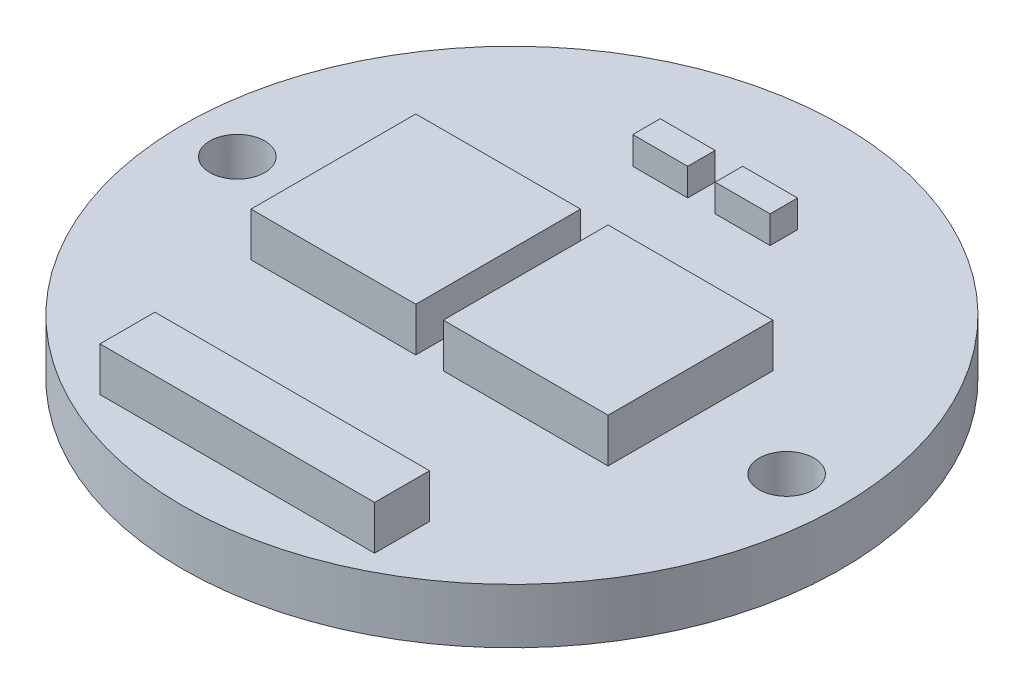
ISO-10303-21;
HEADER;
FILE_DESCRIPTION(('STEP AP214'),'2;1');
FILE_NAME('part.step','',(''),(''),'','','');
FILE_SCHEMA(('AUTOMOTIVE_DESIGN { 1 0 10303 214 1 1 1 1 }'));
ENDSEC;
DATA;
#1=APPLICATION_CONTEXT('core data for automotive mechanical design processes');
#2=APPLICATION_PROTOCOL_DEFINITION('international standard','automotive_design',2000,#1);
#3=PRODUCT_CONTEXT('',#1,'mechanical');
#4=PRODUCT('Part','Part','',(#3));
#5=PRODUCT_RELATED_PRODUCT_CATEGORY('part','',(#4));
#6=PRODUCT_DEFINITION_FORMATION('','',#4);
#7=PRODUCT_DEFINITION_CONTEXT('part definition',#1,'design');
#8=PRODUCT_DEFINITION('design','',#6,#7);
#9=PRODUCT_DEFINITION_SHAPE('','',#8);
#10=(LENGTH_UNIT() NAMED_UNIT(*) SI_UNIT(.MILLI.,.METRE.));
#11=(NAMED_UNIT(*) PLANE_ANGLE_UNIT() SI_UNIT($,.RADIAN.));
#12=(NAMED_UNIT(*) SI_UNIT($,.STERADIAN.) SOLID_ANGLE_UNIT());
#13=UNCERTAINTY_MEASURE_WITH_UNIT(LENGTH_MEASURE(1.E-05),#10,'distance_accuracy_value','');
#14=(GEOMETRIC_REPRESENTATION_CONTEXT(3) GLOBAL_UNCERTAINTY_ASSIGNED_CONTEXT((#13)) GLOBAL_UNIT_ASSIGNED_CONTEXT((#10,
#11,#12)) REPRESENTATION_CONTEXT('',''));
#15=CARTESIAN_POINT('',(0.,0.,0.));
#16=DIRECTION('',(0.,0.,1.));
#17=DIRECTION('',(1.,0.,0.));
#18=AXIS2_PLACEMENT_3D('',#15,#16,#17);
#19=CARTESIAN_POINT('',(0.,0.,0.));
#20=DIRECTION('',(0.,1.,0.));
#21=DIRECTION('',(0.,0.,1.));
#22=AXIS2_PLACEMENT_3D('',#19,#20,#21);
#23=PLANE('',#22);
#24=CARTESIAN_POINT('',(5.,0.,0.));
#25=DIRECTION('',(0.,1.,0.));
#26=DIRECTION('',(0.,0.,1.));
#27=AXIS2_PLACEMENT_3D('',#24,#25,#26);
#28=CIRCLE('',#27,0.5);
#29=CARTESIAN_POINT('',(5.,0.,0.5));
#30=VERTEX_POINT('',#29);
#31=EDGE_CURVE('E601',#30,#30,#28,.F.);
#32=ORIENTED_EDGE('',*,*,#31,.F.);
#33=EDGE_LOOP('',(#32));
#34=FACE_BOUND('',#33,.T.);
#35=CARTESIAN_POINT('',(-5.,0.,0.));
#36=DIRECTION('',(0.,1.,0.));
#37=DIRECTION('',(0.,0.,1.));
#38=AXIS2_PLACEMENT_3D('',#35,#36,#37);
#39=CIRCLE('',#38,0.5);
#40=CARTESIAN_POINT('',(-5.,0.,0.5));
#41=VERTEX_POINT('',#40);
#42=EDGE_CURVE('E615',#41,#41,#39,.F.);
#43=ORIENTED_EDGE('',*,*,#42,.F.);
#44=EDGE_LOOP('',(#43));
#45=FACE_BOUND('',#44,.T.);
#46=CARTESIAN_POINT('',(0.,0.,0.));
#47=DIRECTION('',(0.,1.,0.));
#48=DIRECTION('',(0.,0.,1.));
#49=AXIS2_PLACEMENT_3D('',#46,#47,#48);
#50=CIRCLE('',#49,6.);
#51=CARTESIAN_POINT('',(0.,0.,6.));
#52=VERTEX_POINT('',#51);
#53=EDGE_CURVE('E47',#52,#52,#50,.T.);
#54=ORIENTED_EDGE('',*,*,#53,.F.);
#55=EDGE_LOOP('',(#54));
#56=FACE_BOUND('',#55,.T.);
#57=DIRECTION('',(0.,0.,1.));
#58=VECTOR('',#57,1.);
#59=CARTESIAN_POINT('',(2.5,0.,2.5));
#60=LINE('',#59,#58);
#61=CARTESIAN_POINT('',(2.5,0.,-2.5));
#62=VERTEX_POINT('',#61);
#63=CARTESIAN_POINT('',(2.5,0.,2.5));
#64=VERTEX_POINT('',#63);
#65=EDGE_CURVE('E63',#62,#64,#60,.T.);
#66=ORIENTED_EDGE('',*,*,#65,.F.);
#67=DIRECTION('',(1.,0.,0.));
#68=VECTOR('',#67,1.);
#69=CARTESIAN_POINT('',(-2.5,0.,-2.5));
#70=LINE('',#69,#68);
#71=CARTESIAN_POINT('',(-2.5,0.,-2.5));
#72=VERTEX_POINT('',#71);
#73=EDGE_CURVE('E62',#72,#62,#70,.T.);
#74=ORIENTED_EDGE('',*,*,#73,.F.);
#75=DIRECTION('',(0.,0.,-1.));
#76=VECTOR('',#75,1.);
#77=CARTESIAN_POINT('',(-2.5,0.,2.5));
#78=LINE('',#77,#76);
#79=CARTESIAN_POINT('',(-2.5,0.,2.5));
#80=VERTEX_POINT('',#79);
#81=EDGE_CURVE('E628',#80,#72,#78,.T.);
#82=ORIENTED_EDGE('',*,*,#81,.F.);
#83=DIRECTION('',(-1.,0.,0.));
#84=VECTOR('',#83,1.);
#85=CARTESIAN_POINT('',(-2.5,0.,2.5));
#86=LINE('',#85,#84);
#87=EDGE_CURVE('E610',#64,#80,#86,.T.);
#88=ORIENTED_EDGE('',*,*,#87,.F.);
#89=EDGE_LOOP('',(#66,#74,#82,#88));
#90=FACE_BOUND('',#89,.T.);
#91=ADVANCED_FACE('F44',(#34,#45,#56,#90),#23,.F.);
#92=CARTESIAN_POINT('',(0.,1.,0.));
#93=DIRECTION('',(0.,1.,0.));
#94=DIRECTION('',(0.,0.,1.));
#95=AXIS2_PLACEMENT_3D('',#92,#93,#94);
#96=PLANE('',#95);
#97=CARTESIAN_POINT('',(5.,1.,0.));
#98=DIRECTION('',(0.,1.,0.));
#99=DIRECTION('',(0.,0.,1.));
#100=AXIS2_PLACEMENT_3D('',#97,#98,#99);
#101=CIRCLE('',#100,0.5);
#102=CARTESIAN_POINT('',(5.,1.,0.5));
#103=VERTEX_POINT('',#102);
#104=EDGE_CURVE('E597',#103,#103,#101,.T.);
#105=ORIENTED_EDGE('',*,*,#104,.F.);
#106=EDGE_LOOP('',(#105));
#107=FACE_BOUND('',#106,.T.);
#108=CARTESIAN_POINT('',(-5.,1.,0.));
#109=DIRECTION('',(0.,1.,0.));
#110=DIRECTION('',(0.,0.,-1.));
#111=AXIS2_PLACEMENT_3D('',#108,#109,#110);
#112=CIRCLE('',#111,0.5);
#113=CARTESIAN_POINT('',(-5.,1.,-0.5));
#114=VERTEX_POINT('',#113);
#115=EDGE_CURVE('E606',#114,#114,#112,.T.);
#116=ORIENTED_EDGE('',*,*,#115,.F.);
#117=EDGE_LOOP('',(#116));
#118=FACE_BOUND('',#117,.T.);
#119=DIRECTION('',(-1.,0.,0.));
#120=VECTOR('',#119,1.);
#121=CARTESIAN_POINT('',(0.,1.,-3.45));
#122=LINE('',#121,#120);
#123=CARTESIAN_POINT('',(-0.249999999999999,1.,-3.45));
#124=VERTEX_POINT('',#123);
#125=CARTESIAN_POINT('',(-1.25,1.,-3.45));
#126=VERTEX_POINT('',#125);
#127=EDGE_CURVE('E256',#124,#126,#122,.T.);
#128=ORIENTED_EDGE('',*,*,#127,.T.);
#129=DIRECTION('',(0.,0.,-1.));
#130=VECTOR('',#129,1.);
#131=CARTESIAN_POINT('',(-1.25,1.,0.));
#132=LINE('',#131,#130);
#133=CARTESIAN_POINT('',(-1.25,1.,-3.95));
#134=VERTEX_POINT('',#133);
#135=EDGE_CURVE('E246',#126,#134,#132,.T.);
#136=ORIENTED_EDGE('',*,*,#135,.T.);
#137=DIRECTION('',(-1.,0.,0.));
#138=VECTOR('',#137,1.);
#139=CARTESIAN_POINT('',(0.,1.,-3.95));
#140=LINE('',#139,#138);
#141=CARTESIAN_POINT('',(-0.249999999999999,1.,-3.95));
#142=VERTEX_POINT('',#141);
#143=EDGE_CURVE('E266',#142,#134,#140,.T.);
#144=ORIENTED_EDGE('',*,*,#143,.F.);
#145=DIRECTION('',(0.,0.,-1.));
#146=VECTOR('',#145,1.);
#147=CARTESIAN_POINT('',(-0.249999999999999,1.,0.));
#148=LINE('',#147,#146);
#149=EDGE_CURVE('E261',#124,#142,#148,.T.);
#150=ORIENTED_EDGE('',*,*,#149,.F.);
#151=EDGE_LOOP('',(#128,#136,#144,#150));
#152=FACE_BOUND('',#151,.T.);
#153=DIRECTION('',(1.,0.,0.));
#154=VECTOR('',#153,1.);
#155=CARTESIAN_POINT('',(-2.5,1.,5.));
#156=LINE('',#155,#154);
#157=CARTESIAN_POINT('',(-2.5,1.,5.));
#158=VERTEX_POINT('',#157);
#159=CARTESIAN_POINT('',(2.5,1.,5.));
#160=VERTEX_POINT('',#159);
#161=EDGE_CURVE('E335',#158,#160,#156,.T.);
#162=ORIENTED_EDGE('',*,*,#161,.F.);
#163=DIRECTION('',(0.,0.,1.));
#164=VECTOR('',#163,1.);
#165=CARTESIAN_POINT('',(-2.5,1.,4.));
#166=LINE('',#165,#164);
#167=CARTESIAN_POINT('',(-2.5,1.,4.));
#168=VERTEX_POINT('',#167);
#169=EDGE_CURVE('E384',#168,#158,#166,.T.);
#170=ORIENTED_EDGE('',*,*,#169,.F.);
#171=DIRECTION('',(1.,0.,0.));
#172=VECTOR('',#171,1.);
#173=CARTESIAN_POINT('',(-2.5,1.,4.));
#174=LINE('',#173,#172);
#175=CARTESIAN_POINT('',(2.5,1.,4.));
#176=VERTEX_POINT('',#175);
#177=EDGE_CURVE('E389',#168,#176,#174,.T.);
#178=ORIENTED_EDGE('',*,*,#177,.T.);
#179=DIRECTION('',(0.,0.,1.));
#180=VECTOR('',#179,1.);
#181=CARTESIAN_POINT('',(2.5,1.,4.));
#182=LINE('',#181,#180);
#183=EDGE_CURVE('E391',#176,#160,#182,.T.);
#184=ORIENTED_EDGE('',*,*,#183,.T.);
#185=EDGE_LOOP('',(#162,#170,#178,#184));
#186=FACE_BOUND('',#185,.T.);
#187=DIRECTION('',(1.,0.,0.));
#188=VECTOR('',#187,1.);
#189=CARTESIAN_POINT('',(0.250000000000001,1.,1.5));
#190=LINE('',#189,#188);
#191=CARTESIAN_POINT('',(0.250000000000001,1.,1.5));
#192=VERTEX_POINT('',#191);
#193=CARTESIAN_POINT('',(3.25,1.,1.5));
#194=VERTEX_POINT('',#193);
#195=EDGE_CURVE('E352',#192,#194,#190,.T.);
#196=ORIENTED_EDGE('',*,*,#195,.F.);
#197=DIRECTION('',(0.,0.,1.));
#198=VECTOR('',#197,1.);
#199=CARTESIAN_POINT('',(0.25,1.,-1.5));
#200=LINE('',#199,#198);
#201=CARTESIAN_POINT('',(0.25,1.,-1.5));
#202=VERTEX_POINT('',#201);
#203=EDGE_CURVE('E342',#202,#192,#200,.T.);
#204=ORIENTED_EDGE('',*,*,#203,.F.);
#205=DIRECTION('',(1.,0.,0.));
#206=VECTOR('',#205,1.);
#207=CARTESIAN_POINT('',(0.25,1.,-1.5));
#208=LINE('',#207,#206);
#209=CARTESIAN_POINT('',(3.25,1.,-1.5));
#210=VERTEX_POINT('',#209);
#211=EDGE_CURVE('E347',#202,#210,#208,.T.);
#212=ORIENTED_EDGE('',*,*,#211,.T.);
#213=DIRECTION('',(0.,0.,1.));
#214=VECTOR('',#213,1.);
#215=CARTESIAN_POINT('',(3.25,1.,-1.5));
#216=LINE('',#215,#214);
#217=EDGE_CURVE('E353',#210,#194,#216,.T.);
#218=ORIENTED_EDGE('',*,*,#217,.T.);
#219=EDGE_LOOP('',(#196,#204,#212,#218));
#220=FACE_BOUND('',#219,.T.);
#221=DIRECTION('',(-1.,0.,0.));
#222=VECTOR('',#221,1.);
#223=CARTESIAN_POINT('',(-0.25,1.,-1.5));
#224=LINE('',#223,#222);
#225=CARTESIAN_POINT('',(-0.25,1.,-1.5));
#226=VERTEX_POINT('',#225);
#227=CARTESIAN_POINT('',(-3.25,1.,-1.5));
#228=VERTEX_POINT('',#227);
#229=EDGE_CURVE('E360',#226,#228,#224,.T.);
#230=ORIENTED_EDGE('',*,*,#229,.F.);
#231=DIRECTION('',(0.,0.,1.));
#232=VECTOR('',#231,1.);
#233=CARTESIAN_POINT('',(-0.25,1.,-1.5));
#234=LINE('',#233,#232);
#235=CARTESIAN_POINT('',(-0.250000000000001,1.,1.5));
#236=VERTEX_POINT('',#235);
#237=EDGE_CURVE('E418',#226,#236,#234,.T.);
#238=ORIENTED_EDGE('',*,*,#237,.T.);
#239=DIRECTION('',(-1.,0.,0.));
#240=VECTOR('',#239,1.);
#241=CARTESIAN_POINT('',(-0.250000000000001,1.,1.5));
#242=LINE('',#241,#240);
#243=CARTESIAN_POINT('',(-3.25,1.,1.5));
#244=VERTEX_POINT('',#243);
#245=EDGE_CURVE('E434',#236,#244,#242,.T.);
#246=ORIENTED_EDGE('',*,*,#245,.T.);
#247=DIRECTION('',(0.,0.,1.));
#248=VECTOR('',#247,1.);
#249=CARTESIAN_POINT('',(-3.25,1.,-1.5));
#250=LINE('',#249,#248);
#251=EDGE_CURVE('E431',#228,#244,#250,.T.);
#252=ORIENTED_EDGE('',*,*,#251,.F.);
#253=EDGE_LOOP('',(#230,#238,#246,#252));
#254=FACE_BOUND('',#253,.T.);
#255=CARTESIAN_POINT('',(0.,1.,0.));
#256=DIRECTION('',(0.,1.,0.));
#257=DIRECTION('',(0.,0.,1.));
#258=AXIS2_PLACEMENT_3D('',#255,#256,#257);
#259=CIRCLE('',#258,6.);
#260=CARTESIAN_POINT('',(0.,1.,6.));
#261=VERTEX_POINT('',#260);
#262=EDGE_CURVE('E11',#261,#261,#259,.T.);
#263=ORIENTED_EDGE('',*,*,#262,.T.);
#264=EDGE_LOOP('',(#263));
#265=FACE_BOUND('',#264,.T.);
#266=DIRECTION('',(0.,0.,-1.));
#267=VECTOR('',#266,1.);
#268=CARTESIAN_POINT('',(1.25,1.,0.));
#269=LINE('',#268,#267);
#270=CARTESIAN_POINT('',(1.25,1.,-3.45));
#271=VERTEX_POINT('',#270);
#272=CARTESIAN_POINT('',(1.25,1.,-3.95));
#273=VERTEX_POINT('',#272);
#274=EDGE_CURVE('E237',#271,#273,#269,.T.);
#275=ORIENTED_EDGE('',*,*,#274,.F.);
#276=DIRECTION('',(1.,0.,0.));
#277=VECTOR('',#276,1.);
#278=CARTESIAN_POINT('',(0.,1.,-3.45));
#279=LINE('',#278,#277);
#280=CARTESIAN_POINT('',(0.25,1.,-3.45));
#281=VERTEX_POINT('',#280);
#282=EDGE_CURVE('E227',#281,#271,#279,.T.);
#283=ORIENTED_EDGE('',*,*,#282,.F.);
#284=DIRECTION('',(0.,0.,-1.));
#285=VECTOR('',#284,1.);
#286=CARTESIAN_POINT('',(0.25,1.,0.));
#287=LINE('',#286,#285);
#288=CARTESIAN_POINT('',(0.25,1.,-3.95));
#289=VERTEX_POINT('',#288);
#290=EDGE_CURVE('E291',#281,#289,#287,.T.);
#291=ORIENTED_EDGE('',*,*,#290,.T.);
#292=DIRECTION('',(1.,0.,0.));
#293=VECTOR('',#292,1.);
#294=CARTESIAN_POINT('',(0.,1.,-3.95));
#295=LINE('',#294,#293);
#296=EDGE_CURVE('E306',#289,#273,#295,.T.);
#297=ORIENTED_EDGE('',*,*,#296,.T.);
#298=EDGE_LOOP('',(#275,#283,#291,#297));
#299=FACE_BOUND('',#298,.T.);
#300=ADVANCED_FACE('F464',(#107,#118,#152,#186,#220,#254,#265,#299),#96,.T.);
#301=CARTESIAN_POINT('',(0.,1.,0.));
#302=DIRECTION('',(0.,-1.,0.));
#303=DIRECTION('',(0.,0.,-1.));
#304=AXIS2_PLACEMENT_3D('',#301,#302,#303);
#305=CYLINDRICAL_SURFACE('',#304,6.);
#306=ORIENTED_EDGE('',*,*,#262,.F.);
#307=EDGE_LOOP('',(#306));
#308=FACE_BOUND('',#307,.T.);
#309=ORIENTED_EDGE('',*,*,#53,.T.);
#310=EDGE_LOOP('',(#309));
#311=FACE_BOUND('',#310,.T.);
#312=ADVANCED_FACE('F50',(#308,#311),#305,.T.);
#313=CARTESIAN_POINT('',(-0.25,1.8,-1.5));
#314=DIRECTION('',(0.,0.,1.));
#315=DIRECTION('',(1.,0.,0.));
#316=AXIS2_PLACEMENT_3D('',#313,#314,#315);
#317=PLANE('',#316);
#318=ORIENTED_EDGE('',*,*,#229,.T.);
#319=DIRECTION('',(0.,-1.,0.));
#320=VECTOR('',#319,1.);
#321=CARTESIAN_POINT('',(-3.25,1.8,-1.5));
#322=LINE('',#321,#320);
#323=CARTESIAN_POINT('',(-3.25,1.8,-1.5));
#324=VERTEX_POINT('',#323);
#325=EDGE_CURVE('E451',#324,#228,#322,.T.);
#326=ORIENTED_EDGE('',*,*,#325,.F.);
#327=DIRECTION('',(-1.,0.,0.));
#328=VECTOR('',#327,1.);
#329=CARTESIAN_POINT('',(-0.25,1.8,-1.5));
#330=LINE('',#329,#328);
#331=CARTESIAN_POINT('',(-0.25,1.8,-1.5));
#332=VERTEX_POINT('',#331);
#333=EDGE_CURVE('E414',#332,#324,#330,.T.);
#334=ORIENTED_EDGE('',*,*,#333,.F.);
#335=DIRECTION('',(0.,-1.,0.));
#336=VECTOR('',#335,1.);
#337=CARTESIAN_POINT('',(-0.25,1.8,-1.5));
#338=LINE('',#337,#336);
#339=EDGE_CURVE('E430',#332,#226,#338,.T.);
#340=ORIENTED_EDGE('',*,*,#339,.T.);
#341=EDGE_LOOP('',(#318,#326,#334,#340));
#342=FACE_BOUND('',#341,.T.);
#343=ADVANCED_FACE('F474',(#342),#317,.F.);
#344=CARTESIAN_POINT('',(-3.25,1.8,-1.5));
#345=DIRECTION('',(1.,0.,0.));
#346=DIRECTION('',(0.,0.,-1.));
#347=AXIS2_PLACEMENT_3D('',#344,#345,#346);
#348=PLANE('',#347);
#349=ORIENTED_EDGE('',*,*,#251,.T.);
#350=DIRECTION('',(0.,-1.,0.));
#351=VECTOR('',#350,1.);
#352=CARTESIAN_POINT('',(-3.25,1.8,1.5));
#353=LINE('',#352,#351);
#354=CARTESIAN_POINT('',(-3.25,1.8,1.5));
#355=VERTEX_POINT('',#354);
#356=EDGE_CURVE('E450',#355,#244,#353,.T.);
#357=ORIENTED_EDGE('',*,*,#356,.F.);
#358=DIRECTION('',(0.,0.,1.));
#359=VECTOR('',#358,1.);
#360=CARTESIAN_POINT('',(-3.25,1.8,-1.5));
#361=LINE('',#360,#359);
#362=EDGE_CURVE('E412',#324,#355,#361,.T.);
#363=ORIENTED_EDGE('',*,*,#362,.F.);
#364=ORIENTED_EDGE('',*,*,#325,.T.);
#365=EDGE_LOOP('',(#349,#357,#363,#364));
#366=FACE_BOUND('',#365,.T.);
#367=ADVANCED_FACE('F476',(#366),#348,.F.);
#368=CARTESIAN_POINT('',(-0.250000000000001,1.8,1.5));
#369=DIRECTION('',(0.,0.,1.));
#370=DIRECTION('',(1.,0.,0.));
#371=AXIS2_PLACEMENT_3D('',#368,#369,#370);
#372=PLANE('',#371);
#373=ORIENTED_EDGE('',*,*,#245,.F.);
#374=DIRECTION('',(0.,-1.,0.));
#375=VECTOR('',#374,1.);
#376=CARTESIAN_POINT('',(-0.250000000000001,1.8,1.5));
#377=LINE('',#376,#375);
#378=CARTESIAN_POINT('',(-0.250000000000001,1.8,1.5));
#379=VERTEX_POINT('',#378);
#380=EDGE_CURVE('E444',#379,#236,#377,.T.);
#381=ORIENTED_EDGE('',*,*,#380,.F.);
#382=DIRECTION('',(-1.,0.,0.));
#383=VECTOR('',#382,1.);
#384=CARTESIAN_POINT('',(-0.250000000000001,1.8,1.5));
#385=LINE('',#384,#383);
#386=EDGE_CURVE('E420',#379,#355,#385,.T.);
#387=ORIENTED_EDGE('',*,*,#386,.T.);
#388=ORIENTED_EDGE('',*,*,#356,.T.);
#389=EDGE_LOOP('',(#373,#381,#387,#388));
#390=FACE_BOUND('',#389,.T.);
#391=ADVANCED_FACE('F485',(#390),#372,.T.);
#392=CARTESIAN_POINT('',(-0.25,1.8,-1.5));
#393=DIRECTION('',(1.,0.,0.));
#394=DIRECTION('',(0.,0.,-1.));
#395=AXIS2_PLACEMENT_3D('',#392,#393,#394);
#396=PLANE('',#395);
#397=ORIENTED_EDGE('',*,*,#237,.F.);
#398=ORIENTED_EDGE('',*,*,#339,.F.);
#399=DIRECTION('',(0.,0.,1.));
#400=VECTOR('',#399,1.);
#401=CARTESIAN_POINT('',(-0.25,1.8,-1.5));
#402=LINE('',#401,#400);
#403=EDGE_CURVE('E421',#332,#379,#402,.T.);
#404=ORIENTED_EDGE('',*,*,#403,.T.);
#405=ORIENTED_EDGE('',*,*,#380,.T.);
#406=EDGE_LOOP('',(#397,#398,#404,#405));
#407=FACE_BOUND('',#406,.T.);
#408=ADVANCED_FACE('F484',(#407),#396,.T.);
#409=CARTESIAN_POINT('',(0.,1.8,0.));
#410=DIRECTION('',(0.,1.,0.));
#411=DIRECTION('',(0.,0.,1.));
#412=AXIS2_PLACEMENT_3D('',#409,#410,#411);
#413=PLANE('',#412);
#414=ORIENTED_EDGE('',*,*,#333,.T.);
#415=ORIENTED_EDGE('',*,*,#362,.T.);
#416=ORIENTED_EDGE('',*,*,#386,.F.);
#417=ORIENTED_EDGE('',*,*,#403,.F.);
#418=EDGE_LOOP('',(#414,#415,#416,#417));
#419=FACE_BOUND('',#418,.T.);
#420=ADVANCED_FACE('F487',(#419),#413,.T.);
#421=CARTESIAN_POINT('',(0.250000000000001,1.8,1.5));
#422=DIRECTION('',(0.,0.,-1.));
#423=DIRECTION('',(-1.,0.,0.));
#424=AXIS2_PLACEMENT_3D('',#421,#422,#423);
#425=PLANE('',#424);
#426=ORIENTED_EDGE('',*,*,#195,.T.);
#427=DIRECTION('',(0.,-1.,0.));
#428=VECTOR('',#427,1.);
#429=CARTESIAN_POINT('',(3.25,1.8,1.5));
#430=LINE('',#429,#428);
#431=CARTESIAN_POINT('',(3.25,1.8,1.5));
#432=VERTEX_POINT('',#431);
#433=EDGE_CURVE('E330',#432,#194,#430,.T.);
#434=ORIENTED_EDGE('',*,*,#433,.F.);
#435=DIRECTION('',(1.,0.,0.));
#436=VECTOR('',#435,1.);
#437=CARTESIAN_POINT('',(0.250000000000001,1.8,1.5));
#438=LINE('',#437,#436);
#439=CARTESIAN_POINT('',(0.250000000000001,1.8,1.5));
#440=VERTEX_POINT('',#439);
#441=EDGE_CURVE('E350',#440,#432,#438,.T.);
#442=ORIENTED_EDGE('',*,*,#441,.F.);
#443=DIRECTION('',(0.,-1.,0.));
#444=VECTOR('',#443,1.);
#445=CARTESIAN_POINT('',(0.250000000000001,1.8,1.5));
#446=LINE('',#445,#444);
#447=EDGE_CURVE('E336',#440,#192,#446,.T.);
#448=ORIENTED_EDGE('',*,*,#447,.T.);
#449=EDGE_LOOP('',(#426,#434,#442,#448));
#450=FACE_BOUND('',#449,.T.);
#451=ADVANCED_FACE('F492',(#450),#425,.F.);
#452=CARTESIAN_POINT('',(3.25,1.8,-1.5));
#453=DIRECTION('',(1.,0.,0.));
#454=DIRECTION('',(0.,0.,-1.));
#455=AXIS2_PLACEMENT_3D('',#452,#453,#454);
#456=PLANE('',#455);
#457=ORIENTED_EDGE('',*,*,#217,.F.);
#458=DIRECTION('',(0.,-1.,0.));
#459=VECTOR('',#458,1.);
#460=CARTESIAN_POINT('',(3.25,1.8,-1.5));
#461=LINE('',#460,#459);
#462=CARTESIAN_POINT('',(3.25,1.8,-1.5));
#463=VERTEX_POINT('',#462);
#464=EDGE_CURVE('E332',#463,#210,#461,.T.);
#465=ORIENTED_EDGE('',*,*,#464,.F.);
#466=DIRECTION('',(0.,0.,1.));
#467=VECTOR('',#466,1.);
#468=CARTESIAN_POINT('',(3.25,1.8,-1.5));
#469=LINE('',#468,#467);
#470=EDGE_CURVE('E364',#463,#432,#469,.T.);
#471=ORIENTED_EDGE('',*,*,#470,.T.);
#472=ORIENTED_EDGE('',*,*,#433,.T.);
#473=EDGE_LOOP('',(#457,#465,#471,#472));
#474=FACE_BOUND('',#473,.T.);
#475=ADVANCED_FACE('F527',(#474),#456,.T.);
#476=CARTESIAN_POINT('',(0.25,1.8,-1.5));
#477=DIRECTION('',(0.,0.,-1.));
#478=DIRECTION('',(-1.,0.,0.));
#479=AXIS2_PLACEMENT_3D('',#476,#477,#478);
#480=PLANE('',#479);
#481=ORIENTED_EDGE('',*,*,#211,.F.);
#482=DIRECTION('',(0.,-1.,0.));
#483=VECTOR('',#482,1.);
#484=CARTESIAN_POINT('',(0.25,1.8,-1.5));
#485=LINE('',#484,#483);
#486=CARTESIAN_POINT('',(0.25,1.8,-1.5));
#487=VERTEX_POINT('',#486);
#488=EDGE_CURVE('E333',#487,#202,#485,.T.);
#489=ORIENTED_EDGE('',*,*,#488,.F.);
#490=DIRECTION('',(1.,0.,0.));
#491=VECTOR('',#490,1.);
#492=CARTESIAN_POINT('',(0.25,1.8,-1.5));
#493=LINE('',#492,#491);
#494=EDGE_CURVE('E363',#487,#463,#493,.T.);
#495=ORIENTED_EDGE('',*,*,#494,.T.);
#496=ORIENTED_EDGE('',*,*,#464,.T.);
#497=EDGE_LOOP('',(#481,#489,#495,#496));
#498=FACE_BOUND('',#497,.T.);
#499=ADVANCED_FACE('F525',(#498),#480,.T.);
#500=CARTESIAN_POINT('',(0.25,1.8,-1.5));
#501=DIRECTION('',(1.,0.,0.));
#502=DIRECTION('',(0.,0.,-1.));
#503=AXIS2_PLACEMENT_3D('',#500,#501,#502);
#504=PLANE('',#503);
#505=ORIENTED_EDGE('',*,*,#203,.T.);
#506=ORIENTED_EDGE('',*,*,#447,.F.);
#507=DIRECTION('',(0.,0.,1.));
#508=VECTOR('',#507,1.);
#509=CARTESIAN_POINT('',(0.25,1.8,-1.5));
#510=LINE('',#509,#508);
#511=EDGE_CURVE('E345',#487,#440,#510,.T.);
#512=ORIENTED_EDGE('',*,*,#511,.F.);
#513=ORIENTED_EDGE('',*,*,#488,.T.);
#514=EDGE_LOOP('',(#505,#506,#512,#513));
#515=FACE_BOUND('',#514,.T.);
#516=ADVANCED_FACE('F519',(#515),#504,.F.);
#517=CARTESIAN_POINT('',(0.,1.8,0.));
#518=DIRECTION('',(0.,-1.,0.));
#519=DIRECTION('',(0.,0.,-1.));
#520=AXIS2_PLACEMENT_3D('',#517,#518,#519);
#521=PLANE('',#520);
#522=ORIENTED_EDGE('',*,*,#441,.T.);
#523=ORIENTED_EDGE('',*,*,#470,.F.);
#524=ORIENTED_EDGE('',*,*,#494,.F.);
#525=ORIENTED_EDGE('',*,*,#511,.T.);
#526=EDGE_LOOP('',(#522,#523,#524,#525));
#527=FACE_BOUND('',#526,.T.);
#528=ADVANCED_FACE('F513',(#527),#521,.F.);
#529=CARTESIAN_POINT('',(-2.5,1.8,5.));
#530=DIRECTION('',(0.,0.,-1.));
#531=DIRECTION('',(-1.,0.,0.));
#532=AXIS2_PLACEMENT_3D('',#529,#530,#531);
#533=PLANE('',#532);
#534=ORIENTED_EDGE('',*,*,#161,.T.);
#535=DIRECTION('',(0.,-1.,0.));
#536=VECTOR('',#535,1.);
#537=CARTESIAN_POINT('',(2.5,1.8,5.));
#538=LINE('',#537,#536);
#539=CARTESIAN_POINT('',(2.5,1.8,5.));
#540=VERTEX_POINT('',#539);
#541=EDGE_CURVE('E290',#540,#160,#538,.T.);
#542=ORIENTED_EDGE('',*,*,#541,.F.);
#543=DIRECTION('',(1.,0.,0.));
#544=VECTOR('',#543,1.);
#545=CARTESIAN_POINT('',(-2.5,1.8,5.));
#546=LINE('',#545,#544);
#547=CARTESIAN_POINT('',(-2.5,1.8,5.));
#548=VERTEX_POINT('',#547);
#549=EDGE_CURVE('E386',#548,#540,#546,.T.);
#550=ORIENTED_EDGE('',*,*,#549,.F.);
#551=DIRECTION('',(0.,-1.,0.));
#552=VECTOR('',#551,1.);
#553=CARTESIAN_POINT('',(-2.5,1.8,5.));
#554=LINE('',#553,#552);
#555=EDGE_CURVE('E379',#548,#158,#554,.T.);
#556=ORIENTED_EDGE('',*,*,#555,.T.);
#557=EDGE_LOOP('',(#534,#542,#550,#556));
#558=FACE_BOUND('',#557,.T.);
#559=ADVANCED_FACE('F512',(#558),#533,.F.);
#560=CARTESIAN_POINT('',(2.5,1.8,4.));
#561=DIRECTION('',(1.,0.,0.));
#562=DIRECTION('',(0.,0.,-1.));
#563=AXIS2_PLACEMENT_3D('',#560,#561,#562);
#564=PLANE('',#563);
#565=ORIENTED_EDGE('',*,*,#183,.F.);
#566=DIRECTION('',(0.,-1.,0.));
#567=VECTOR('',#566,1.);
#568=CARTESIAN_POINT('',(2.5,1.8,4.));
#569=LINE('',#568,#567);
#570=CARTESIAN_POINT('',(2.5,1.8,4.));
#571=VERTEX_POINT('',#570);
#572=EDGE_CURVE('E372',#571,#176,#569,.T.);
#573=ORIENTED_EDGE('',*,*,#572,.F.);
#574=DIRECTION('',(0.,0.,1.));
#575=VECTOR('',#574,1.);
#576=CARTESIAN_POINT('',(2.5,1.8,4.));
#577=LINE('',#576,#575);
#578=EDGE_CURVE('E403',#571,#540,#577,.T.);
#579=ORIENTED_EDGE('',*,*,#578,.T.);
#580=ORIENTED_EDGE('',*,*,#541,.T.);
#581=EDGE_LOOP('',(#565,#573,#579,#580));
#582=FACE_BOUND('',#581,.T.);
#583=ADVANCED_FACE('F510',(#582),#564,.T.);
#584=CARTESIAN_POINT('',(-2.5,1.8,4.));
#585=DIRECTION('',(0.,0.,-1.));
#586=DIRECTION('',(-1.,0.,0.));
#587=AXIS2_PLACEMENT_3D('',#584,#585,#586);
#588=PLANE('',#587);
#589=ORIENTED_EDGE('',*,*,#177,.F.);
#590=DIRECTION('',(0.,-1.,0.));
#591=VECTOR('',#590,1.);
#592=CARTESIAN_POINT('',(-2.5,1.8,4.));
#593=LINE('',#592,#591);
#594=CARTESIAN_POINT('',(-2.5,1.8,4.));
#595=VERTEX_POINT('',#594);
#596=EDGE_CURVE('E380',#595,#168,#593,.T.);
#597=ORIENTED_EDGE('',*,*,#596,.F.);
#598=DIRECTION('',(1.,0.,0.));
#599=VECTOR('',#598,1.);
#600=CARTESIAN_POINT('',(-2.5,1.8,4.));
#601=LINE('',#600,#599);
#602=EDGE_CURVE('E402',#595,#571,#601,.T.);
#603=ORIENTED_EDGE('',*,*,#602,.T.);
#604=ORIENTED_EDGE('',*,*,#572,.T.);
#605=EDGE_LOOP('',(#589,#597,#603,#604));
#606=FACE_BOUND('',#605,.T.);
#607=ADVANCED_FACE('F501',(#606),#588,.T.);
#608=CARTESIAN_POINT('',(-2.5,1.8,4.));
#609=DIRECTION('',(1.,0.,0.));
#610=DIRECTION('',(0.,0.,-1.));
#611=AXIS2_PLACEMENT_3D('',#608,#609,#610);
#612=PLANE('',#611);
#613=ORIENTED_EDGE('',*,*,#169,.T.);
#614=ORIENTED_EDGE('',*,*,#555,.F.);
#615=DIRECTION('',(0.,0.,1.));
#616=VECTOR('',#615,1.);
#617=CARTESIAN_POINT('',(-2.5,1.8,4.));
#618=LINE('',#617,#616);
#619=EDGE_CURVE('E383',#595,#548,#618,.T.);
#620=ORIENTED_EDGE('',*,*,#619,.F.);
#621=ORIENTED_EDGE('',*,*,#596,.T.);
#622=EDGE_LOOP('',(#613,#614,#620,#621));
#623=FACE_BOUND('',#622,.T.);
#624=ADVANCED_FACE('F496',(#623),#612,.F.);
#625=CARTESIAN_POINT('',(0.,1.8,0.));
#626=DIRECTION('',(0.,-1.,0.));
#627=DIRECTION('',(0.,0.,-1.));
#628=AXIS2_PLACEMENT_3D('',#625,#626,#627);
#629=PLANE('',#628);
#630=ORIENTED_EDGE('',*,*,#549,.T.);
#631=ORIENTED_EDGE('',*,*,#578,.F.);
#632=ORIENTED_EDGE('',*,*,#602,.F.);
#633=ORIENTED_EDGE('',*,*,#619,.T.);
#634=EDGE_LOOP('',(#630,#631,#632,#633));
#635=FACE_BOUND('',#634,.T.);
#636=ADVANCED_FACE('F494',(#635),#629,.F.);
#637=CARTESIAN_POINT('',(0.,1.5,-3.45));
#638=DIRECTION('',(0.,0.,-1.));
#639=DIRECTION('',(-1.,0.,0.));
#640=AXIS2_PLACEMENT_3D('',#637,#638,#639);
#641=PLANE('',#640);
#642=ORIENTED_EDGE('',*,*,#282,.T.);
#643=DIRECTION('',(0.,-1.,0.));
#644=VECTOR('',#643,1.);
#645=CARTESIAN_POINT('',(1.25,1.5,-3.45));
#646=LINE('',#645,#644);
#647=CARTESIAN_POINT('',(1.25,1.5,-3.45));
#648=VERTEX_POINT('',#647);
#649=EDGE_CURVE('E265',#648,#271,#646,.T.);
#650=ORIENTED_EDGE('',*,*,#649,.F.);
#651=DIRECTION('',(1.,0.,0.));
#652=VECTOR('',#651,1.);
#653=CARTESIAN_POINT('',(0.,1.5,-3.45));
#654=LINE('',#653,#652);
#655=CARTESIAN_POINT('',(0.25,1.5,-3.45));
#656=VERTEX_POINT('',#655);
#657=EDGE_CURVE('E287',#656,#648,#654,.T.);
#658=ORIENTED_EDGE('',*,*,#657,.F.);
#659=DIRECTION('',(0.,-1.,0.));
#660=VECTOR('',#659,1.);
#661=CARTESIAN_POINT('',(0.25,1.5,-3.45));
#662=LINE('',#661,#660);
#663=EDGE_CURVE('E305',#656,#281,#662,.T.);
#664=ORIENTED_EDGE('',*,*,#663,.T.);
#665=EDGE_LOOP('',(#642,#650,#658,#664));
#666=FACE_BOUND('',#665,.T.);
#667=ADVANCED_FACE('F499',(#666),#641,.F.);
#668=CARTESIAN_POINT('',(1.25,1.5,0.));
#669=DIRECTION('',(-1.,0.,0.));
#670=DIRECTION('',(0.,0.,1.));
#671=AXIS2_PLACEMENT_3D('',#668,#669,#670);
#672=PLANE('',#671);
#673=ORIENTED_EDGE('',*,*,#274,.T.);
#674=DIRECTION('',(0.,-1.,0.));
#675=VECTOR('',#674,1.);
#676=CARTESIAN_POINT('',(1.25,1.5,-3.95));
#677=LINE('',#676,#675);
#678=CARTESIAN_POINT('',(1.25,1.5,-3.95));
#679=VERTEX_POINT('',#678);
#680=EDGE_CURVE('E319',#679,#273,#677,.T.);
#681=ORIENTED_EDGE('',*,*,#680,.F.);
#682=DIRECTION('',(0.,0.,-1.));
#683=VECTOR('',#682,1.);
#684=CARTESIAN_POINT('',(1.25,1.5,0.));
#685=LINE('',#684,#683);
#686=EDGE_CURVE('E295',#648,#679,#685,.T.);
#687=ORIENTED_EDGE('',*,*,#686,.F.);
#688=ORIENTED_EDGE('',*,*,#649,.T.);
#689=EDGE_LOOP('',(#673,#681,#687,#688));
#690=FACE_BOUND('',#689,.T.);
#691=ADVANCED_FACE('F540',(#690),#672,.F.);
#692=CARTESIAN_POINT('',(0.,1.5,-3.95));
#693=DIRECTION('',(0.,0.,-1.));
#694=DIRECTION('',(-1.,0.,0.));
#695=AXIS2_PLACEMENT_3D('',#692,#693,#694);
#696=PLANE('',#695);
#697=ORIENTED_EDGE('',*,*,#296,.F.);
#698=DIRECTION('',(0.,-1.,0.));
#699=VECTOR('',#698,1.);
#700=CARTESIAN_POINT('',(0.25,1.5,-3.95));
#701=LINE('',#700,#699);
#702=CARTESIAN_POINT('',(0.25,1.5,-3.95));
#703=VERTEX_POINT('',#702);
#704=EDGE_CURVE('E316',#703,#289,#701,.T.);
#705=ORIENTED_EDGE('',*,*,#704,.F.);
#706=DIRECTION('',(1.,0.,0.));
#707=VECTOR('',#706,1.);
#708=CARTESIAN_POINT('',(0.,1.5,-3.95));
#709=LINE('',#708,#707);
#710=EDGE_CURVE('E298',#703,#679,#709,.T.);
#711=ORIENTED_EDGE('',*,*,#710,.T.);
#712=ORIENTED_EDGE('',*,*,#680,.T.);
#713=EDGE_LOOP('',(#697,#705,#711,#712));
#714=FACE_BOUND('',#713,.T.);
#715=ADVANCED_FACE('F541',(#714),#696,.T.);
#716=CARTESIAN_POINT('',(0.25,1.5,0.));
#717=DIRECTION('',(-1.,0.,0.));
#718=DIRECTION('',(0.,0.,1.));
#719=AXIS2_PLACEMENT_3D('',#716,#717,#718);
#720=PLANE('',#719);
#721=ORIENTED_EDGE('',*,*,#290,.F.);
#722=ORIENTED_EDGE('',*,*,#663,.F.);
#723=DIRECTION('',(0.,0.,-1.));
#724=VECTOR('',#723,1.);
#725=CARTESIAN_POINT('',(0.25,1.5,0.));
#726=LINE('',#725,#724);
#727=EDGE_CURVE('E297',#656,#703,#726,.T.);
#728=ORIENTED_EDGE('',*,*,#727,.T.);
#729=ORIENTED_EDGE('',*,*,#704,.T.);
#730=EDGE_LOOP('',(#721,#722,#728,#729));
#731=FACE_BOUND('',#730,.T.);
#732=ADVANCED_FACE('F544',(#731),#720,.T.);
#733=CARTESIAN_POINT('',(0.,1.5,0.));
#734=DIRECTION('',(0.,1.,0.));
#735=DIRECTION('',(0.,0.,1.));
#736=AXIS2_PLACEMENT_3D('',#733,#734,#735);
#737=PLANE('',#736);
#738=ORIENTED_EDGE('',*,*,#657,.T.);
#739=ORIENTED_EDGE('',*,*,#686,.T.);
#740=ORIENTED_EDGE('',*,*,#710,.F.);
#741=ORIENTED_EDGE('',*,*,#727,.F.);
#742=EDGE_LOOP('',(#738,#739,#740,#741));
#743=FACE_BOUND('',#742,.T.);
#744=ADVANCED_FACE('F548',(#743),#737,.T.);
#745=CARTESIAN_POINT('',(0.,1.5,-3.45));
#746=DIRECTION('',(0.,0.,1.));
#747=DIRECTION('',(1.,0.,0.));
#748=AXIS2_PLACEMENT_3D('',#745,#746,#747);
#749=PLANE('',#748);
#750=ORIENTED_EDGE('',*,*,#127,.F.);
#751=DIRECTION('',(0.,-1.,0.));
#752=VECTOR('',#751,1.);
#753=CARTESIAN_POINT('',(-0.249999999999999,1.5,-3.45));
#754=LINE('',#753,#752);
#755=CARTESIAN_POINT('',(-0.249999999999999,1.5,-3.45));
#756=VERTEX_POINT('',#755);
#757=EDGE_CURVE('E281',#756,#124,#754,.T.);
#758=ORIENTED_EDGE('',*,*,#757,.F.);
#759=DIRECTION('',(-1.,0.,0.));
#760=VECTOR('',#759,1.);
#761=CARTESIAN_POINT('',(0.,1.5,-3.45));
#762=LINE('',#761,#760);
#763=CARTESIAN_POINT('',(-1.25,1.5,-3.45));
#764=VERTEX_POINT('',#763);
#765=EDGE_CURVE('E245',#756,#764,#762,.T.);
#766=ORIENTED_EDGE('',*,*,#765,.T.);
#767=DIRECTION('',(0.,-1.,0.));
#768=VECTOR('',#767,1.);
#769=CARTESIAN_POINT('',(-1.25,1.5,-3.45));
#770=LINE('',#769,#768);
#771=EDGE_CURVE('E260',#764,#126,#770,.T.);
#772=ORIENTED_EDGE('',*,*,#771,.T.);
#773=EDGE_LOOP('',(#750,#758,#766,#772));
#774=FACE_BOUND('',#773,.T.);
#775=ADVANCED_FACE('F554',(#774),#749,.T.);
#776=CARTESIAN_POINT('',(-0.249999999999999,1.5,0.));
#777=DIRECTION('',(-1.,0.,0.));
#778=DIRECTION('',(0.,0.,1.));
#779=AXIS2_PLACEMENT_3D('',#776,#777,#778);
#780=PLANE('',#779);
#781=ORIENTED_EDGE('',*,*,#149,.T.);
#782=DIRECTION('',(0.,-1.,0.));
#783=VECTOR('',#782,1.);
#784=CARTESIAN_POINT('',(-0.249999999999999,1.5,-3.95));
#785=LINE('',#784,#783);
#786=CARTESIAN_POINT('',(-0.249999999999999,1.5,-3.95));
#787=VERTEX_POINT('',#786);
#788=EDGE_CURVE('E276',#787,#142,#785,.T.);
#789=ORIENTED_EDGE('',*,*,#788,.F.);
#790=DIRECTION('',(0.,0.,-1.));
#791=VECTOR('',#790,1.);
#792=CARTESIAN_POINT('',(-0.249999999999999,1.5,0.));
#793=LINE('',#792,#791);
#794=EDGE_CURVE('E249',#756,#787,#793,.T.);
#795=ORIENTED_EDGE('',*,*,#794,.F.);
#796=ORIENTED_EDGE('',*,*,#757,.T.);
#797=EDGE_LOOP('',(#781,#789,#795,#796));
#798=FACE_BOUND('',#797,.T.);
#799=ADVANCED_FACE('F560',(#798),#780,.F.);
#800=CARTESIAN_POINT('',(0.,1.5,-3.95));
#801=DIRECTION('',(0.,0.,1.));
#802=DIRECTION('',(1.,0.,0.));
#803=AXIS2_PLACEMENT_3D('',#800,#801,#802);
#804=PLANE('',#803);
#805=ORIENTED_EDGE('',*,*,#143,.T.);
#806=DIRECTION('',(0.,-1.,0.));
#807=VECTOR('',#806,1.);
#808=CARTESIAN_POINT('',(-1.25,1.5,-3.95));
#809=LINE('',#808,#807);
#810=CARTESIAN_POINT('',(-1.25,1.5,-3.95));
#811=VERTEX_POINT('',#810);
#812=EDGE_CURVE('E274',#811,#134,#809,.T.);
#813=ORIENTED_EDGE('',*,*,#812,.F.);
#814=DIRECTION('',(-1.,0.,0.));
#815=VECTOR('',#814,1.);
#816=CARTESIAN_POINT('',(0.,1.5,-3.95));
#817=LINE('',#816,#815);
#818=EDGE_CURVE('E247',#787,#811,#817,.T.);
#819=ORIENTED_EDGE('',*,*,#818,.F.);
#820=ORIENTED_EDGE('',*,*,#788,.T.);
#821=EDGE_LOOP('',(#805,#813,#819,#820));
#822=FACE_BOUND('',#821,.T.);
#823=ADVANCED_FACE('F561',(#822),#804,.F.);
#824=CARTESIAN_POINT('',(-1.25,1.5,0.));
#825=DIRECTION('',(-1.,0.,0.));
#826=DIRECTION('',(0.,0.,1.));
#827=AXIS2_PLACEMENT_3D('',#824,#825,#826);
#828=PLANE('',#827);
#829=ORIENTED_EDGE('',*,*,#135,.F.);
#830=ORIENTED_EDGE('',*,*,#771,.F.);
#831=DIRECTION('',(0.,0.,-1.));
#832=VECTOR('',#831,1.);
#833=CARTESIAN_POINT('',(-1.25,1.5,0.));
#834=LINE('',#833,#832);
#835=EDGE_CURVE('E251',#764,#811,#834,.T.);
#836=ORIENTED_EDGE('',*,*,#835,.T.);
#837=ORIENTED_EDGE('',*,*,#812,.T.);
#838=EDGE_LOOP('',(#829,#830,#836,#837));
#839=FACE_BOUND('',#838,.T.);
#840=ADVANCED_FACE('F564',(#839),#828,.T.);
#841=CARTESIAN_POINT('',(0.,1.5,0.));
#842=DIRECTION('',(0.,1.,0.));
#843=DIRECTION('',(0.,0.,1.));
#844=AXIS2_PLACEMENT_3D('',#841,#842,#843);
#845=PLANE('',#844);
#846=ORIENTED_EDGE('',*,*,#765,.F.);
#847=ORIENTED_EDGE('',*,*,#794,.T.);
#848=ORIENTED_EDGE('',*,*,#818,.T.);
#849=ORIENTED_EDGE('',*,*,#835,.F.);
#850=EDGE_LOOP('',(#846,#847,#848,#849));
#851=FACE_BOUND('',#850,.T.);
#852=ADVANCED_FACE('F569',(#851),#845,.T.);
#853=CARTESIAN_POINT('',(2.5,-1.,2.5));
#854=DIRECTION('',(-1.,0.,0.));
#855=DIRECTION('',(0.,0.,1.));
#856=AXIS2_PLACEMENT_3D('',#853,#854,#855);
#857=PLANE('',#856);
#858=ORIENTED_EDGE('',*,*,#65,.T.);
#859=DIRECTION('',(0.,1.,0.));
#860=VECTOR('',#859,1.);
#861=CARTESIAN_POINT('',(2.5,-1.,2.5));
#862=LINE('',#861,#860);
#863=CARTESIAN_POINT('',(2.5,-1.,2.5));
#864=VERTEX_POINT('',#863);
#865=EDGE_CURVE('E209',#864,#64,#862,.T.);
#866=ORIENTED_EDGE('',*,*,#865,.F.);
#867=DIRECTION('',(0.,0.,1.));
#868=VECTOR('',#867,1.);
#869=CARTESIAN_POINT('',(2.5,-1.,2.5));
#870=LINE('',#869,#868);
#871=CARTESIAN_POINT('',(2.5,-1.,-2.5));
#872=VERTEX_POINT('',#871);
#873=EDGE_CURVE('E220',#872,#864,#870,.T.);
#874=ORIENTED_EDGE('',*,*,#873,.F.);
#875=DIRECTION('',(0.,1.,0.));
#876=VECTOR('',#875,1.);
#877=CARTESIAN_POINT('',(2.5,-1.,-2.5));
#878=LINE('',#877,#876);
#879=EDGE_CURVE('E625',#872,#62,#878,.T.);
#880=ORIENTED_EDGE('',*,*,#879,.T.);
#881=EDGE_LOOP('',(#858,#866,#874,#880));
#882=FACE_BOUND('',#881,.T.);
#883=ADVANCED_FACE('F226',(#882),#857,.F.);
#884=CARTESIAN_POINT('',(-2.5,-1.,2.5));
#885=DIRECTION('',(0.,0.,-1.));
#886=DIRECTION('',(-1.,0.,0.));
#887=AXIS2_PLACEMENT_3D('',#884,#885,#886);
#888=PLANE('',#887);
#889=ORIENTED_EDGE('',*,*,#87,.T.);
#890=DIRECTION('',(0.,1.,0.));
#891=VECTOR('',#890,1.);
#892=CARTESIAN_POINT('',(-2.5,-1.,2.5));
#893=LINE('',#892,#891);
#894=CARTESIAN_POINT('',(-2.5,-1.,2.5));
#895=VERTEX_POINT('',#894);
#896=EDGE_CURVE('E215',#895,#80,#893,.T.);
#897=ORIENTED_EDGE('',*,*,#896,.F.);
#898=DIRECTION('',(-1.,0.,0.));
#899=VECTOR('',#898,1.);
#900=CARTESIAN_POINT('',(-2.5,-1.,2.5));
#901=LINE('',#900,#899);
#902=EDGE_CURVE('E202',#864,#895,#901,.T.);
#903=ORIENTED_EDGE('',*,*,#902,.F.);
#904=ORIENTED_EDGE('',*,*,#865,.T.);
#905=EDGE_LOOP('',(#889,#897,#903,#904));
#906=FACE_BOUND('',#905,.T.);
#907=ADVANCED_FACE('F208',(#906),#888,.F.);
#908=CARTESIAN_POINT('',(-2.5,-1.,2.5));
#909=DIRECTION('',(1.,0.,0.));
#910=DIRECTION('',(0.,0.,-1.));
#911=AXIS2_PLACEMENT_3D('',#908,#909,#910);
#912=PLANE('',#911);
#913=ORIENTED_EDGE('',*,*,#81,.T.);
#914=DIRECTION('',(0.,1.,0.));
#915=VECTOR('',#914,1.);
#916=CARTESIAN_POINT('',(-2.5,-1.,-2.5));
#917=LINE('',#916,#915);
#918=CARTESIAN_POINT('',(-2.5,-1.,-2.5));
#919=VERTEX_POINT('',#918);
#920=EDGE_CURVE('E236',#919,#72,#917,.T.);
#921=ORIENTED_EDGE('',*,*,#920,.F.);
#922=DIRECTION('',(0.,0.,-1.));
#923=VECTOR('',#922,1.);
#924=CARTESIAN_POINT('',(-2.5,-1.,2.5));
#925=LINE('',#924,#923);
#926=EDGE_CURVE('E216',#895,#919,#925,.T.);
#927=ORIENTED_EDGE('',*,*,#926,.F.);
#928=ORIENTED_EDGE('',*,*,#896,.T.);
#929=EDGE_LOOP('',(#913,#921,#927,#928));
#930=FACE_BOUND('',#929,.T.);
#931=ADVANCED_FACE('F580',(#930),#912,.F.);
#932=CARTESIAN_POINT('',(-2.5,-1.,-2.5));
#933=DIRECTION('',(0.,0.,1.));
#934=DIRECTION('',(1.,0.,0.));
#935=AXIS2_PLACEMENT_3D('',#932,#933,#934);
#936=PLANE('',#935);
#937=ORIENTED_EDGE('',*,*,#73,.T.);
#938=ORIENTED_EDGE('',*,*,#879,.F.);
#939=DIRECTION('',(1.,0.,0.));
#940=VECTOR('',#939,1.);
#941=CARTESIAN_POINT('',(-2.5,-1.,-2.5));
#942=LINE('',#941,#940);
#943=EDGE_CURVE('E225',#919,#872,#942,.T.);
#944=ORIENTED_EDGE('',*,*,#943,.F.);
#945=ORIENTED_EDGE('',*,*,#920,.T.);
#946=EDGE_LOOP('',(#937,#938,#944,#945));
#947=FACE_BOUND('',#946,.T.);
#948=ADVANCED_FACE('F583',(#947),#936,.F.);
#949=CARTESIAN_POINT('',(0.,-1.,0.));
#950=DIRECTION('',(0.,-1.,0.));
#951=DIRECTION('',(0.,0.,-1.));
#952=AXIS2_PLACEMENT_3D('',#949,#950,#951);
#953=PLANE('',#952);
#954=ORIENTED_EDGE('',*,*,#873,.T.);
#955=ORIENTED_EDGE('',*,*,#902,.T.);
#956=ORIENTED_EDGE('',*,*,#926,.T.);
#957=ORIENTED_EDGE('',*,*,#943,.T.);
#958=EDGE_LOOP('',(#954,#955,#956,#957));
#959=FACE_BOUND('',#958,.T.);
#960=ADVANCED_FACE('F219',(#959),#953,.T.);
#961=CARTESIAN_POINT('',(-5.,-1.001,0.));
#962=DIRECTION('',(0.,1.,0.));
#963=DIRECTION('',(0.,0.,1.));
#964=AXIS2_PLACEMENT_3D('',#961,#962,#963);
#965=CYLINDRICAL_SURFACE('',#964,0.5);
#966=ORIENTED_EDGE('',*,*,#115,.T.);
#967=EDGE_LOOP('',(#966));
#968=FACE_BOUND('',#967,.T.);
#969=ORIENTED_EDGE('',*,*,#42,.T.);
#970=EDGE_LOOP('',(#969));
#971=FACE_BOUND('',#970,.T.);
#972=ADVANCED_FACE('F590',(#968,#971),#965,.F.);
#973=CARTESIAN_POINT('',(5.,-1.001,0.));
#974=DIRECTION('',(0.,1.,0.));
#975=DIRECTION('',(0.,0.,1.));
#976=AXIS2_PLACEMENT_3D('',#973,#974,#975);
#977=CYLINDRICAL_SURFACE('',#976,0.5);
#978=ORIENTED_EDGE('',*,*,#104,.T.);
#979=EDGE_LOOP('',(#978));
#980=FACE_BOUND('',#979,.T.);
#981=ORIENTED_EDGE('',*,*,#31,.T.);
#982=EDGE_LOOP('',(#981));
#983=FACE_BOUND('',#982,.T.);
#984=ADVANCED_FACE('F587',(#980,#983),#977,.F.);
#985=CLOSED_SHELL('',(#91,#300,#312,#343,#367,#391,#408,#420,#451,#475,#499,#516,#528,#559,#583,
#607,#624,#636,#667,#691,#715,#732,#744,#775,#799,#823,#840,#852,#883,#907,#931,#948,#960,#972,#984));
#986=MANIFOLD_SOLID_BREP('B2',#985);
#987=ADVANCED_BREP_SHAPE_REPRESENTATION('',(#18,#986),#14);
#988=SHAPE_DEFINITION_REPRESENTATION(#9,#987);
ENDSEC;
END-ISO-10303-21;
